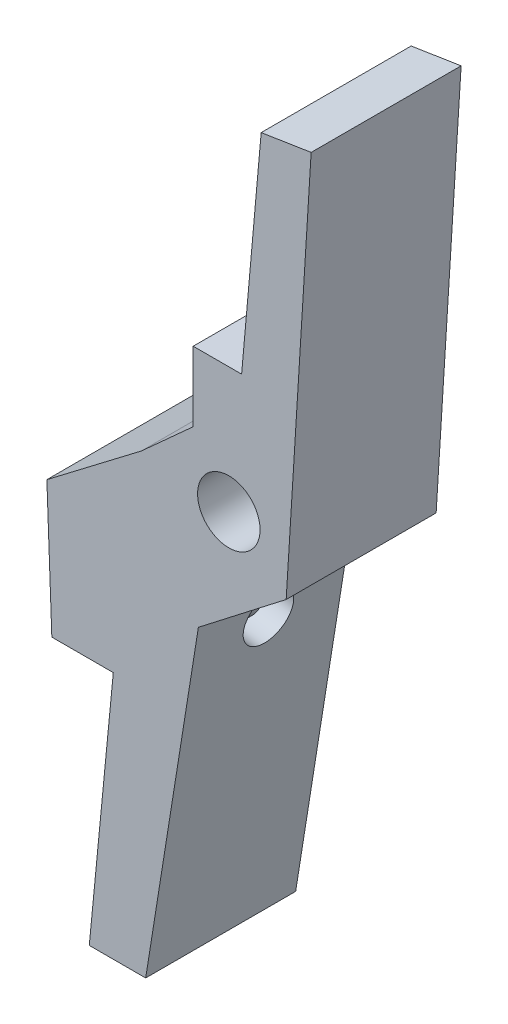
ISO-10303-21;
HEADER;
FILE_DESCRIPTION(('STEP AP214'),'2;1');
FILE_NAME('part.step','',(''),(''),'','','');
FILE_SCHEMA(('AUTOMOTIVE_DESIGN { 1 0 10303 214 1 1 1 1 }'));
ENDSEC;
DATA;
#1=APPLICATION_CONTEXT('core data for automotive mechanical design processes');
#2=APPLICATION_PROTOCOL_DEFINITION('international standard','automotive_design',2000,#1);
#3=PRODUCT_CONTEXT('',#1,'mechanical');
#4=PRODUCT('Part','Part','',(#3));
#5=PRODUCT_RELATED_PRODUCT_CATEGORY('part','',(#4));
#6=PRODUCT_DEFINITION_FORMATION('','',#4);
#7=PRODUCT_DEFINITION_CONTEXT('part definition',#1,'design');
#8=PRODUCT_DEFINITION('design','',#6,#7);
#9=PRODUCT_DEFINITION_SHAPE('','',#8);
#10=(LENGTH_UNIT() NAMED_UNIT(*) SI_UNIT(.MILLI.,.METRE.));
#11=(NAMED_UNIT(*) PLANE_ANGLE_UNIT() SI_UNIT($,.RADIAN.));
#12=(NAMED_UNIT(*) SI_UNIT($,.STERADIAN.) SOLID_ANGLE_UNIT());
#13=UNCERTAINTY_MEASURE_WITH_UNIT(LENGTH_MEASURE(1.E-05),#10,'distance_accuracy_value','');
#14=(GEOMETRIC_REPRESENTATION_CONTEXT(3) GLOBAL_UNCERTAINTY_ASSIGNED_CONTEXT((#13)) GLOBAL_UNIT_ASSIGNED_CONTEXT((#10,
#11,#12)) REPRESENTATION_CONTEXT('',''));
#15=CARTESIAN_POINT('',(0.,0.,0.));
#16=DIRECTION('',(0.,0.,1.));
#17=DIRECTION('',(1.,0.,0.));
#18=AXIS2_PLACEMENT_3D('',#15,#16,#17);
#19=CARTESIAN_POINT('',(0.,0.,12.));
#20=DIRECTION('',(0.,0.,1.));
#21=DIRECTION('',(1.,0.,0.));
#22=AXIS2_PLACEMENT_3D('',#19,#20,#21);
#23=PLANE('',#22);
#24=DIRECTION('',(-1.,0.,0.));
#25=VECTOR('',#24,1.);
#26=CARTESIAN_POINT('',(-2.84953772658631,10.0472916760826,12.));
#27=LINE('',#26,#25);
#28=CARTESIAN_POINT('',(1.02476848603479,10.0472916760826,12.));
#29=VERTEX_POINT('',#28);
#30=CARTESIAN_POINT('',(-2.84953772658631,10.0472916760826,12.));
#31=VERTEX_POINT('',#30);
#32=EDGE_CURVE('E186',#29,#31,#27,.T.);
#33=ORIENTED_EDGE('',*,*,#32,.T.);
#34=DIRECTION('',(0.,-1.,0.));
#35=VECTOR('',#34,1.);
#36=CARTESIAN_POINT('',(-2.84953772658631,4.46912261998814,12.));
#37=LINE('',#36,#35);
#38=CARTESIAN_POINT('',(-2.84953772658631,4.46912261998814,12.));
#39=VERTEX_POINT('',#38);
#40=EDGE_CURVE('E109',#31,#39,#37,.T.);
#41=ORIENTED_EDGE('',*,*,#40,.T.);
#42=DIRECTION('',(-0.741262028825612,-0.671215766070298,0.));
#43=VECTOR('',#42,1.);
#44=CARTESIAN_POINT('',(-2.84953772658631,4.46912261998814,12.));
#45=LINE('',#44,#43);
#46=CARTESIAN_POINT('',(-7.,0.710862239635323,12.));
#47=VERTEX_POINT('',#46);
#48=EDGE_CURVE('E236',#39,#47,#45,.T.);
#49=ORIENTED_EDGE('',*,*,#48,.T.);
#50=DIRECTION('',(-0.795166547645736,-0.606391096162502,0.));
#51=VECTOR('',#50,1.);
#52=CARTESIAN_POINT('',(-14.5585198268527,-5.05323728988011,12.));
#53=LINE('',#52,#51);
#54=CARTESIAN_POINT('',(-14.5585198268527,-5.05323728988011,12.));
#55=VERTEX_POINT('',#54);
#56=EDGE_CURVE('E233',#47,#55,#53,.T.);
#57=ORIENTED_EDGE('',*,*,#56,.T.);
#58=DIRECTION('',(0.0370592773706425,-0.999313069043313,0.));
#59=VECTOR('',#58,1.);
#60=CARTESIAN_POINT('',(-14.161167405107,-15.7679488611603,12.));
#61=LINE('',#60,#59);
#62=CARTESIAN_POINT('',(-14.161167405107,-15.7679488611603,12.));
#63=VERTEX_POINT('',#62);
#64=EDGE_CURVE('E235',#55,#63,#61,.T.);
#65=ORIENTED_EDGE('',*,*,#64,.T.);
#66=DIRECTION('',(1.,0.,0.));
#67=VECTOR('',#66,1.);
#68=CARTESIAN_POINT('',(-14.161167405107,-15.7679488611603,12.));
#69=LINE('',#68,#67);
#70=CARTESIAN_POINT('',(-9.24288968650914,-15.7679488611603,12.));
#71=VERTEX_POINT('',#70);
#72=EDGE_CURVE('E238',#63,#71,#69,.T.);
#73=ORIENTED_EDGE('',*,*,#72,.T.);
#74=DIRECTION('',(-0.0962982664613053,-0.995352522414319,0.));
#75=VECTOR('',#74,1.);
#76=CARTESIAN_POINT('',(-9.24288968650914,-15.7679488611603,12.));
#77=LINE('',#76,#75);
#78=CARTESIAN_POINT('',(-11.1649154997917,-35.6342799146375,12.));
#79=VERTEX_POINT('',#78);
#80=EDGE_CURVE('E244',#71,#79,#77,.T.);
#81=ORIENTED_EDGE('',*,*,#80,.T.);
#82=DIRECTION('',(1.,0.,0.));
#83=VECTOR('',#82,1.);
#84=CARTESIAN_POINT('',(-11.1649154997917,-35.6342799146375,12.));
#85=LINE('',#84,#83);
#86=CARTESIAN_POINT('',(-6.65174609692045,-35.6342799146375,12.));
#87=VERTEX_POINT('',#86);
#88=EDGE_CURVE('E246',#79,#87,#85,.T.);
#89=ORIENTED_EDGE('',*,*,#88,.T.);
#90=DIRECTION('',(0.157668148571442,0.987492154361772,0.));
#91=VECTOR('',#90,1.);
#92=CARTESIAN_POINT('',(-6.65174609692045,-35.6342799146375,12.));
#93=LINE('',#92,#91);
#94=CARTESIAN_POINT('',(-2.43508475753211,-9.22488760570282,12.));
#95=VERTEX_POINT('',#94);
#96=EDGE_CURVE('E248',#87,#95,#93,.T.);
#97=ORIENTED_EDGE('',*,*,#96,.T.);
#98=DIRECTION('',(0.790730316399644,0.61216465654799,0.));
#99=VECTOR('',#98,1.);
#100=CARTESIAN_POINT('',(4.58883890770533,-3.78713249631581,12.));
#101=LINE('',#100,#99);
#102=CARTESIAN_POINT('',(4.58883890770533,-3.78713249631581,12.));
#103=VERTEX_POINT('',#102);
#104=EDGE_CURVE('E143',#95,#103,#101,.T.);
#105=ORIENTED_EDGE('',*,*,#104,.T.);
#106=DIRECTION('',(0.0624095793533407,0.998050622165499,0.));
#107=VECTOR('',#106,1.);
#108=CARTESIAN_POINT('',(6.58883890770533,28.1967594801032,12.));
#109=LINE('',#108,#107);
#110=CARTESIAN_POINT('',(6.58883890770533,28.1967594801032,12.));
#111=VERTEX_POINT('',#110);
#112=EDGE_CURVE('E137',#103,#111,#109,.T.);
#113=ORIENTED_EDGE('',*,*,#112,.T.);
#114=DIRECTION('',(-0.987909560187012,-0.155031290038831,0.));
#115=VECTOR('',#114,1.);
#116=CARTESIAN_POINT('',(6.58883890770533,28.1967594801032,12.));
#117=LINE('',#116,#115);
#118=CARTESIAN_POINT('',(2.58883890770533,27.5690449755103,12.));
#119=VERTEX_POINT('',#118);
#120=EDGE_CURVE('E141',#111,#119,#117,.T.);
#121=ORIENTED_EDGE('',*,*,#120,.T.);
#122=DIRECTION('',(-0.0889109677130818,-0.996039577436722,0.));
#123=VECTOR('',#122,1.);
#124=CARTESIAN_POINT('',(1.02476848603479,10.0472916760826,12.));
#125=LINE('',#124,#123);
#126=EDGE_CURVE('E50',#119,#29,#125,.T.);
#127=ORIENTED_EDGE('',*,*,#126,.T.);
#128=EDGE_LOOP('',(#33,#41,#49,#57,#65,#73,#81,#89,#97,#105,#113,#121,#127));
#129=FACE_BOUND('',#128,.T.);
#130=CARTESIAN_POINT('',(0.,0.,12.));
#131=DIRECTION('',(0.,0.,1.));
#132=DIRECTION('',(1.,0.,0.));
#133=AXIS2_PLACEMENT_3D('',#130,#131,#132);
#134=CIRCLE('',#133,2.5);
#135=CARTESIAN_POINT('',(2.5,0.,12.));
#136=VERTEX_POINT('',#135);
#137=EDGE_CURVE('E165',#136,#136,#134,.T.);
#138=ORIENTED_EDGE('',*,*,#137,.F.);
#139=EDGE_LOOP('',(#138));
#140=FACE_BOUND('',#139,.T.);
#141=ADVANCED_FACE('F33',(#129,#140),#23,.T.);
#142=CARTESIAN_POINT('',(0.,0.,0.));
#143=DIRECTION('',(0.,0.,1.));
#144=DIRECTION('',(1.,0.,0.));
#145=AXIS2_PLACEMENT_3D('',#142,#143,#144);
#146=PLANE('',#145);
#147=DIRECTION('',(-1.,0.,0.));
#148=VECTOR('',#147,1.);
#149=CARTESIAN_POINT('',(-2.84953772658631,10.0472916760826,0.));
#150=LINE('',#149,#148);
#151=CARTESIAN_POINT('',(1.02476848603479,10.0472916760826,0.));
#152=VERTEX_POINT('',#151);
#153=CARTESIAN_POINT('',(-2.84953772658631,10.0472916760826,0.));
#154=VERTEX_POINT('',#153);
#155=EDGE_CURVE('E161',#152,#154,#150,.T.);
#156=ORIENTED_EDGE('',*,*,#155,.F.);
#157=DIRECTION('',(-0.0889109677130818,-0.996039577436722,0.));
#158=VECTOR('',#157,1.);
#159=CARTESIAN_POINT('',(1.02476848603479,10.0472916760826,0.));
#160=LINE('',#159,#158);
#161=CARTESIAN_POINT('',(2.58883890770533,27.5690449755103,0.));
#162=VERTEX_POINT('',#161);
#163=EDGE_CURVE('E100',#162,#152,#160,.T.);
#164=ORIENTED_EDGE('',*,*,#163,.F.);
#165=DIRECTION('',(-0.987909560187012,-0.155031290038831,0.));
#166=VECTOR('',#165,1.);
#167=CARTESIAN_POINT('',(6.58883890770533,28.1967594801032,0.));
#168=LINE('',#167,#166);
#169=CARTESIAN_POINT('',(6.58883890770533,28.1967594801032,0.));
#170=VERTEX_POINT('',#169);
#171=EDGE_CURVE('E94',#170,#162,#168,.T.);
#172=ORIENTED_EDGE('',*,*,#171,.F.);
#173=DIRECTION('',(0.0624095793533407,0.998050622165499,0.));
#174=VECTOR('',#173,1.);
#175=CARTESIAN_POINT('',(6.58883890770533,28.1967594801032,0.));
#176=LINE('',#175,#174);
#177=CARTESIAN_POINT('',(4.58883890770533,-3.78713249631581,0.));
#178=VERTEX_POINT('',#177);
#179=EDGE_CURVE('E151',#178,#170,#176,.T.);
#180=ORIENTED_EDGE('',*,*,#179,.F.);
#181=DIRECTION('',(0.790730316399644,0.61216465654799,0.));
#182=VECTOR('',#181,1.);
#183=CARTESIAN_POINT('',(4.58883890770533,-3.78713249631581,0.));
#184=LINE('',#183,#182);
#185=CARTESIAN_POINT('',(-2.43508475753211,-9.22488760570282,0.));
#186=VERTEX_POINT('',#185);
#187=EDGE_CURVE('E181',#186,#178,#184,.T.);
#188=ORIENTED_EDGE('',*,*,#187,.F.);
#189=DIRECTION('',(0.157668148571442,0.987492154361772,0.));
#190=VECTOR('',#189,1.);
#191=CARTESIAN_POINT('',(-6.65174609692045,-35.6342799146375,0.));
#192=LINE('',#191,#190);
#193=CARTESIAN_POINT('',(-6.65174609692045,-35.6342799146375,0.));
#194=VERTEX_POINT('',#193);
#195=EDGE_CURVE('E179',#194,#186,#192,.T.);
#196=ORIENTED_EDGE('',*,*,#195,.F.);
#197=DIRECTION('',(1.,0.,0.));
#198=VECTOR('',#197,1.);
#199=CARTESIAN_POINT('',(-11.1649154997917,-35.6342799146375,0.));
#200=LINE('',#199,#198);
#201=CARTESIAN_POINT('',(-11.1649154997917,-35.6342799146375,0.));
#202=VERTEX_POINT('',#201);
#203=EDGE_CURVE('E177',#202,#194,#200,.T.);
#204=ORIENTED_EDGE('',*,*,#203,.F.);
#205=DIRECTION('',(-0.0962982664613053,-0.995352522414319,0.));
#206=VECTOR('',#205,1.);
#207=CARTESIAN_POINT('',(-9.24288968650914,-15.7679488611603,0.));
#208=LINE('',#207,#206);
#209=CARTESIAN_POINT('',(-9.24288968650914,-15.7679488611603,0.));
#210=VERTEX_POINT('',#209);
#211=EDGE_CURVE('E175',#210,#202,#208,.T.);
#212=ORIENTED_EDGE('',*,*,#211,.F.);
#213=DIRECTION('',(1.,0.,0.));
#214=VECTOR('',#213,1.);
#215=CARTESIAN_POINT('',(-14.161167405107,-15.7679488611603,0.));
#216=LINE('',#215,#214);
#217=CARTESIAN_POINT('',(-14.161167405107,-15.7679488611603,0.));
#218=VERTEX_POINT('',#217);
#219=EDGE_CURVE('E173',#218,#210,#216,.T.);
#220=ORIENTED_EDGE('',*,*,#219,.F.);
#221=DIRECTION('',(0.0370592773706425,-0.999313069043313,0.));
#222=VECTOR('',#221,1.);
#223=CARTESIAN_POINT('',(-14.161167405107,-15.7679488611603,0.));
#224=LINE('',#223,#222);
#225=CARTESIAN_POINT('',(-14.5585198268527,-5.05323728988011,0.));
#226=VERTEX_POINT('',#225);
#227=EDGE_CURVE('E171',#226,#218,#224,.T.);
#228=ORIENTED_EDGE('',*,*,#227,.F.);
#229=DIRECTION('',(-0.795166547645736,-0.606391096162502,0.));
#230=VECTOR('',#229,1.);
#231=CARTESIAN_POINT('',(-14.5585198268527,-5.05323728988011,0.));
#232=LINE('',#231,#230);
#233=CARTESIAN_POINT('',(-7.,0.710862239635323,0.));
#234=VERTEX_POINT('',#233);
#235=EDGE_CURVE('E169',#234,#226,#232,.T.);
#236=ORIENTED_EDGE('',*,*,#235,.F.);
#237=DIRECTION('',(-0.741262028825612,-0.671215766070298,0.));
#238=VECTOR('',#237,1.);
#239=CARTESIAN_POINT('',(-2.84953772658631,4.46912261998814,0.));
#240=LINE('',#239,#238);
#241=CARTESIAN_POINT('',(-2.84953772658631,4.46912261998814,0.));
#242=VERTEX_POINT('',#241);
#243=EDGE_CURVE('E167',#242,#234,#240,.T.);
#244=ORIENTED_EDGE('',*,*,#243,.F.);
#245=DIRECTION('',(0.,-1.,0.));
#246=VECTOR('',#245,1.);
#247=CARTESIAN_POINT('',(-2.84953772658631,4.46912261998814,0.));
#248=LINE('',#247,#246);
#249=EDGE_CURVE('E164',#154,#242,#248,.T.);
#250=ORIENTED_EDGE('',*,*,#249,.F.);
#251=EDGE_LOOP('',(#156,#164,#172,#180,#188,#196,#204,#212,#220,#228,#236,#244,#250));
#252=FACE_BOUND('',#251,.T.);
#253=CARTESIAN_POINT('',(0.,0.,0.));
#254=DIRECTION('',(0.,0.,1.));
#255=DIRECTION('',(1.,0.,0.));
#256=AXIS2_PLACEMENT_3D('',#253,#254,#255);
#257=CIRCLE('',#256,2.5);
#258=CARTESIAN_POINT('',(2.5,0.,0.));
#259=VERTEX_POINT('',#258);
#260=EDGE_CURVE('E393',#259,#259,#257,.T.);
#261=ORIENTED_EDGE('',*,*,#260,.T.);
#262=EDGE_LOOP('',(#261));
#263=FACE_BOUND('',#262,.T.);
#264=ADVANCED_FACE('F220',(#252,#263),#146,.F.);
#265=CARTESIAN_POINT('',(-2.84953772658631,10.0472916760826,12.));
#266=DIRECTION('',(0.,-1.,0.));
#267=DIRECTION('',(0.,0.,-1.));
#268=AXIS2_PLACEMENT_3D('',#265,#266,#267);
#269=PLANE('',#268);
#270=ORIENTED_EDGE('',*,*,#155,.T.);
#271=DIRECTION('',(0.,0.,-1.));
#272=VECTOR('',#271,1.);
#273=CARTESIAN_POINT('',(-2.84953772658631,10.0472916760826,12.));
#274=LINE('',#273,#272);
#275=EDGE_CURVE('E42',#31,#154,#274,.T.);
#276=ORIENTED_EDGE('',*,*,#275,.F.);
#277=ORIENTED_EDGE('',*,*,#32,.F.);
#278=DIRECTION('',(0.,0.,-1.));
#279=VECTOR('',#278,1.);
#280=CARTESIAN_POINT('',(1.02476848603479,10.0472916760826,12.));
#281=LINE('',#280,#279);
#282=EDGE_CURVE('E157',#29,#152,#281,.T.);
#283=ORIENTED_EDGE('',*,*,#282,.T.);
#284=EDGE_LOOP('',(#270,#276,#277,#283));
#285=FACE_BOUND('',#284,.T.);
#286=ADVANCED_FACE('F218',(#285),#269,.F.);
#287=CARTESIAN_POINT('',(-2.84953772658631,4.46912261998814,12.));
#288=DIRECTION('',(1.,0.,0.));
#289=DIRECTION('',(0.,0.,-1.));
#290=AXIS2_PLACEMENT_3D('',#287,#288,#289);
#291=PLANE('',#290);
#292=ORIENTED_EDGE('',*,*,#249,.T.);
#293=DIRECTION('',(0.,0.,-1.));
#294=VECTOR('',#293,1.);
#295=CARTESIAN_POINT('',(-2.84953772658631,4.46912261998814,12.));
#296=LINE('',#295,#294);
#297=EDGE_CURVE('E211',#39,#242,#296,.T.);
#298=ORIENTED_EDGE('',*,*,#297,.F.);
#299=ORIENTED_EDGE('',*,*,#40,.F.);
#300=ORIENTED_EDGE('',*,*,#275,.T.);
#301=EDGE_LOOP('',(#292,#298,#299,#300));
#302=FACE_BOUND('',#301,.T.);
#303=ADVANCED_FACE('F214',(#302),#291,.F.);
#304=CARTESIAN_POINT('',(-2.84953772658631,4.46912261998814,12.));
#305=DIRECTION('',(0.671215766070298,-0.741262028825612,0.));
#306=DIRECTION('',(0.741262028825612,0.671215766070298,0.));
#307=AXIS2_PLACEMENT_3D('',#304,#305,#306);
#308=PLANE('',#307);
#309=ORIENTED_EDGE('',*,*,#243,.T.);
#310=DIRECTION('',(0.,0.,-1.));
#311=VECTOR('',#310,1.);
#312=CARTESIAN_POINT('',(-7.,0.710862239635323,12.));
#313=LINE('',#312,#311);
#314=EDGE_CURVE('E208',#47,#234,#313,.T.);
#315=ORIENTED_EDGE('',*,*,#314,.F.);
#316=ORIENTED_EDGE('',*,*,#48,.F.);
#317=ORIENTED_EDGE('',*,*,#297,.T.);
#318=EDGE_LOOP('',(#309,#315,#316,#317));
#319=FACE_BOUND('',#318,.T.);
#320=ADVANCED_FACE('F227',(#319),#308,.F.);
#321=CARTESIAN_POINT('',(-14.5585198268527,-5.05323728988011,12.));
#322=DIRECTION('',(0.606391096162502,-0.795166547645736,0.));
#323=DIRECTION('',(0.795166547645736,0.606391096162503,0.));
#324=AXIS2_PLACEMENT_3D('',#321,#322,#323);
#325=PLANE('',#324);
#326=ORIENTED_EDGE('',*,*,#235,.T.);
#327=DIRECTION('',(0.,0.,-1.));
#328=VECTOR('',#327,1.);
#329=CARTESIAN_POINT('',(-14.5585198268527,-5.05323728988011,12.));
#330=LINE('',#329,#328);
#331=EDGE_CURVE('E205',#55,#226,#330,.T.);
#332=ORIENTED_EDGE('',*,*,#331,.F.);
#333=ORIENTED_EDGE('',*,*,#56,.F.);
#334=ORIENTED_EDGE('',*,*,#314,.T.);
#335=EDGE_LOOP('',(#326,#332,#333,#334));
#336=FACE_BOUND('',#335,.T.);
#337=ADVANCED_FACE('F231',(#336),#325,.F.);
#338=CARTESIAN_POINT('',(-14.161167405107,-15.7679488611603,12.));
#339=DIRECTION('',(0.999313069043313,0.0370592773706425,0.));
#340=DIRECTION('',(-0.0370592773706425,0.999313069043313,0.));
#341=AXIS2_PLACEMENT_3D('',#338,#339,#340);
#342=PLANE('',#341);
#343=ORIENTED_EDGE('',*,*,#227,.T.);
#344=DIRECTION('',(0.,0.,-1.));
#345=VECTOR('',#344,1.);
#346=CARTESIAN_POINT('',(-14.161167405107,-15.7679488611603,12.));
#347=LINE('',#346,#345);
#348=EDGE_CURVE('E202',#63,#218,#347,.T.);
#349=ORIENTED_EDGE('',*,*,#348,.F.);
#350=ORIENTED_EDGE('',*,*,#64,.F.);
#351=ORIENTED_EDGE('',*,*,#331,.T.);
#352=EDGE_LOOP('',(#343,#349,#350,#351));
#353=FACE_BOUND('',#352,.T.);
#354=ADVANCED_FACE('F274',(#353),#342,.F.);
#355=CARTESIAN_POINT('',(-14.161167405107,-15.7679488611603,12.));
#356=DIRECTION('',(0.,1.,0.));
#357=DIRECTION('',(-1.,0.,0.));
#358=AXIS2_PLACEMENT_3D('',#355,#356,#357);
#359=PLANE('',#358);
#360=ORIENTED_EDGE('',*,*,#219,.T.);
#361=DIRECTION('',(0.,0.,-1.));
#362=VECTOR('',#361,1.);
#363=CARTESIAN_POINT('',(-9.24288968650914,-15.7679488611603,12.));
#364=LINE('',#363,#362);
#365=EDGE_CURVE('E199',#71,#210,#364,.T.);
#366=ORIENTED_EDGE('',*,*,#365,.F.);
#367=ORIENTED_EDGE('',*,*,#72,.F.);
#368=ORIENTED_EDGE('',*,*,#348,.T.);
#369=EDGE_LOOP('',(#360,#366,#367,#368));
#370=FACE_BOUND('',#369,.T.);
#371=ADVANCED_FACE('F271',(#370),#359,.F.);
#372=CARTESIAN_POINT('',(-9.24288968650914,-15.7679488611603,12.));
#373=DIRECTION('',(0.995352522414319,-0.0962982664613053,0.));
#374=DIRECTION('',(0.0962982664613053,0.995352522414319,0.));
#375=AXIS2_PLACEMENT_3D('',#372,#373,#374);
#376=PLANE('',#375);
#377=ORIENTED_EDGE('',*,*,#211,.T.);
#378=DIRECTION('',(0.,0.,-1.));
#379=VECTOR('',#378,1.);
#380=CARTESIAN_POINT('',(-11.1649154997917,-35.6342799146375,12.));
#381=LINE('',#380,#379);
#382=EDGE_CURVE('E196',#79,#202,#381,.T.);
#383=ORIENTED_EDGE('',*,*,#382,.F.);
#384=ORIENTED_EDGE('',*,*,#80,.F.);
#385=ORIENTED_EDGE('',*,*,#365,.T.);
#386=EDGE_LOOP('',(#377,#383,#384,#385));
#387=FACE_BOUND('',#386,.T.);
#388=ADVANCED_FACE('F267',(#387),#376,.F.);
#389=CARTESIAN_POINT('',(-11.1649154997917,-35.6342799146375,12.));
#390=DIRECTION('',(0.,1.,0.));
#391=DIRECTION('',(-1.,0.,0.));
#392=AXIS2_PLACEMENT_3D('',#389,#390,#391);
#393=PLANE('',#392);
#394=ORIENTED_EDGE('',*,*,#203,.T.);
#395=DIRECTION('',(0.,0.,-1.));
#396=VECTOR('',#395,1.);
#397=CARTESIAN_POINT('',(-6.65174609692045,-35.6342799146375,12.));
#398=LINE('',#397,#396);
#399=EDGE_CURVE('E193',#87,#194,#398,.T.);
#400=ORIENTED_EDGE('',*,*,#399,.F.);
#401=ORIENTED_EDGE('',*,*,#88,.F.);
#402=ORIENTED_EDGE('',*,*,#382,.T.);
#403=EDGE_LOOP('',(#394,#400,#401,#402));
#404=FACE_BOUND('',#403,.T.);
#405=ADVANCED_FACE('F263',(#404),#393,.F.);
#406=CARTESIAN_POINT('',(-6.65174609692045,-35.6342799146375,12.));
#407=DIRECTION('',(-0.987492154361772,0.157668148571442,0.));
#408=DIRECTION('',(-0.157668148571442,-0.987492154361772,0.));
#409=AXIS2_PLACEMENT_3D('',#406,#407,#408);
#410=PLANE('',#409);
#411=CARTESIAN_POINT('',(-2.82925512896071,-11.6936179916073,6.));
#412=DIRECTION('',(0.987492154361772,-0.157668148571442,0.));
#413=DIRECTION('',(0.157668148571442,0.987492154361772,0.));
#414=AXIS2_PLACEMENT_3D('',#411,#412,#413);
#415=CIRCLE('',#414,2.);
#416=CARTESIAN_POINT('',(-2.51391883181783,-9.71863368288371,6.));
#417=VERTEX_POINT('',#416);
#418=EDGE_CURVE('E386',#417,#417,#415,.T.);
#419=ORIENTED_EDGE('',*,*,#418,.F.);
#420=EDGE_LOOP('',(#419));
#421=FACE_BOUND('',#420,.T.);
#422=ORIENTED_EDGE('',*,*,#195,.T.);
#423=DIRECTION('',(0.,0.,-1.));
#424=VECTOR('',#423,1.);
#425=CARTESIAN_POINT('',(-2.43508475753211,-9.22488760570282,12.));
#426=LINE('',#425,#424);
#427=EDGE_CURVE('E190',#95,#186,#426,.T.);
#428=ORIENTED_EDGE('',*,*,#427,.F.);
#429=ORIENTED_EDGE('',*,*,#96,.F.);
#430=ORIENTED_EDGE('',*,*,#399,.T.);
#431=EDGE_LOOP('',(#422,#428,#429,#430));
#432=FACE_BOUND('',#431,.T.);
#433=ADVANCED_FACE('F254',(#421,#432),#410,.F.);
#434=CARTESIAN_POINT('',(4.58883890770533,-3.78713249631581,12.));
#435=DIRECTION('',(-0.61216465654799,0.790730316399644,0.));
#436=DIRECTION('',(-0.790730316399644,-0.61216465654799,0.));
#437=AXIS2_PLACEMENT_3D('',#434,#435,#436);
#438=PLANE('',#437);
#439=ORIENTED_EDGE('',*,*,#187,.T.);
#440=DIRECTION('',(0.,0.,-1.));
#441=VECTOR('',#440,1.);
#442=CARTESIAN_POINT('',(4.58883890770533,-3.78713249631581,12.));
#443=LINE('',#442,#441);
#444=EDGE_CURVE('E152',#103,#178,#443,.T.);
#445=ORIENTED_EDGE('',*,*,#444,.F.);
#446=ORIENTED_EDGE('',*,*,#104,.F.);
#447=ORIENTED_EDGE('',*,*,#427,.T.);
#448=EDGE_LOOP('',(#439,#445,#446,#447));
#449=FACE_BOUND('',#448,.T.);
#450=ADVANCED_FACE('F258',(#449),#438,.F.);
#451=CARTESIAN_POINT('',(6.58883890770533,28.1967594801032,12.));
#452=DIRECTION('',(-0.998050622165499,0.0624095793533407,0.));
#453=DIRECTION('',(-0.0624095793533407,-0.998050622165499,0.));
#454=AXIS2_PLACEMENT_3D('',#451,#452,#453);
#455=PLANE('',#454);
#456=ORIENTED_EDGE('',*,*,#179,.T.);
#457=DIRECTION('',(0.,0.,-1.));
#458=VECTOR('',#457,1.);
#459=CARTESIAN_POINT('',(6.58883890770533,28.1967594801032,12.));
#460=LINE('',#459,#458);
#461=EDGE_CURVE('E148',#111,#170,#460,.T.);
#462=ORIENTED_EDGE('',*,*,#461,.F.);
#463=ORIENTED_EDGE('',*,*,#112,.F.);
#464=ORIENTED_EDGE('',*,*,#444,.T.);
#465=EDGE_LOOP('',(#456,#462,#463,#464));
#466=FACE_BOUND('',#465,.T.);
#467=ADVANCED_FACE('F149',(#466),#455,.F.);
#468=CARTESIAN_POINT('',(6.58883890770533,28.1967594801032,12.));
#469=DIRECTION('',(0.155031290038831,-0.987909560187012,0.));
#470=DIRECTION('',(0.987909560187012,0.155031290038831,0.));
#471=AXIS2_PLACEMENT_3D('',#468,#469,#470);
#472=PLANE('',#471);
#473=ORIENTED_EDGE('',*,*,#171,.T.);
#474=DIRECTION('',(0.,0.,-1.));
#475=VECTOR('',#474,1.);
#476=CARTESIAN_POINT('',(2.58883890770533,27.5690449755103,12.));
#477=LINE('',#476,#475);
#478=EDGE_CURVE('E153',#119,#162,#477,.T.);
#479=ORIENTED_EDGE('',*,*,#478,.F.);
#480=ORIENTED_EDGE('',*,*,#120,.F.);
#481=ORIENTED_EDGE('',*,*,#461,.T.);
#482=EDGE_LOOP('',(#473,#479,#480,#481));
#483=FACE_BOUND('',#482,.T.);
#484=ADVANCED_FACE('F155',(#483),#472,.F.);
#485=CARTESIAN_POINT('',(1.02476848603479,10.0472916760826,12.));
#486=DIRECTION('',(0.996039577436722,-0.0889109677130818,0.));
#487=DIRECTION('',(0.0889109677130818,0.996039577436722,0.));
#488=AXIS2_PLACEMENT_3D('',#485,#486,#487);
#489=PLANE('',#488);
#490=ORIENTED_EDGE('',*,*,#163,.T.);
#491=ORIENTED_EDGE('',*,*,#282,.F.);
#492=ORIENTED_EDGE('',*,*,#126,.F.);
#493=ORIENTED_EDGE('',*,*,#478,.T.);
#494=EDGE_LOOP('',(#490,#491,#492,#493));
#495=FACE_BOUND('',#494,.T.);
#496=ADVANCED_FACE('F293',(#495),#489,.F.);
#497=CARTESIAN_POINT('',(0.,0.,12.));
#498=DIRECTION('',(0.,0.,-1.));
#499=DIRECTION('',(-1.,0.,0.));
#500=AXIS2_PLACEMENT_3D('',#497,#498,#499);
#501=CYLINDRICAL_SURFACE('',#500,2.5);
#502=ORIENTED_EDGE('',*,*,#137,.T.);
#503=EDGE_LOOP('',(#502));
#504=FACE_BOUND('',#503,.T.);
#505=ORIENTED_EDGE('',*,*,#260,.F.);
#506=EDGE_LOOP('',(#505));
#507=FACE_BOUND('',#506,.T.);
#508=ADVANCED_FACE('F290',(#504,#507),#501,.F.);
#509=CARTESIAN_POINT('',(-7.76671590076957,-10.90527724875,6.));
#510=DIRECTION('',(0.987492154361772,-0.157668148571442,0.));
#511=DIRECTION('',(0.157668148571442,0.987492154361772,0.));
#512=AXIS2_PLACEMENT_3D('',#509,#510,#511);
#513=CYLINDRICAL_SURFACE('',#512,2.);
#514=CARTESIAN_POINT('',(-7.76671590076957,-10.90527724875,6.));
#515=DIRECTION('',(0.987492154361772,-0.157668148571442,0.));
#516=DIRECTION('',(0.157668148571442,0.987492154361772,0.));
#517=AXIS2_PLACEMENT_3D('',#514,#515,#516);
#518=CIRCLE('',#517,2.);
#519=CARTESIAN_POINT('',(-7.45137960362669,-8.9302929400265,6.));
#520=VERTEX_POINT('',#519);
#521=EDGE_CURVE('E389',#520,#520,#518,.T.);
#522=ORIENTED_EDGE('',*,*,#521,.F.);
#523=EDGE_LOOP('',(#522));
#524=FACE_BOUND('',#523,.T.);
#525=ORIENTED_EDGE('',*,*,#418,.T.);
#526=EDGE_LOOP('',(#525));
#527=FACE_BOUND('',#526,.T.);
#528=ADVANCED_FACE('F345',(#524,#527),#513,.F.);
#529=CARTESIAN_POINT('',(-7.76671590076957,-10.90527724875,6.));
#530=DIRECTION('',(0.987492154361772,-0.157668148571442,0.));
#531=DIRECTION('',(0.157668148571442,0.987492154361772,0.));
#532=AXIS2_PLACEMENT_3D('',#529,#530,#531);
#533=PLANE('',#532);
#534=CARTESIAN_POINT('',(-7.76671590076957,-10.90527724875,6.));
#535=DIRECTION('',(0.987492154361772,-0.157668148571442,0.));
#536=DIRECTION('',(0.157668148571442,0.987492154361772,0.));
#537=AXIS2_PLACEMENT_3D('',#534,#535,#536);
#538=CIRCLE('',#537,1.5);
#539=CARTESIAN_POINT('',(-7.53021367791241,-9.42403901720739,6.));
#540=VERTEX_POINT('',#539);
#541=EDGE_CURVE('E385',#540,#540,#538,.T.);
#542=ORIENTED_EDGE('',*,*,#541,.F.);
#543=EDGE_LOOP('',(#542));
#544=FACE_BOUND('',#543,.T.);
#545=ORIENTED_EDGE('',*,*,#521,.T.);
#546=EDGE_LOOP('',(#545));
#547=FACE_BOUND('',#546,.T.);
#548=ADVANCED_FACE('F351',(#544,#547),#533,.T.);
#549=CARTESIAN_POINT('',(-3.81674728332248,-11.5359498430358,6.));
#550=DIRECTION('',(-0.987492154361772,0.157668148571442,0.));
#551=DIRECTION('',(-0.157668148571442,-0.987492154361772,0.));
#552=AXIS2_PLACEMENT_3D('',#549,#550,#551);
#553=CYLINDRICAL_SURFACE('',#552,1.5);
#554=CARTESIAN_POINT('',(-5.29798551486514,-11.2994476201786,6.));
#555=DIRECTION('',(-0.987492154361772,0.157668148571442,0.));
#556=DIRECTION('',(-0.157668148571442,-0.987492154361772,0.));
#557=AXIS2_PLACEMENT_3D('',#554,#555,#556);
#558=CIRCLE('',#557,1.5);
#559=CARTESIAN_POINT('',(-5.5344877377223,-12.7806858517213,6.));
#560=VERTEX_POINT('',#559);
#561=EDGE_CURVE('E11',#560,#560,#558,.T.);
#562=ORIENTED_EDGE('',*,*,#561,.T.);
#563=EDGE_LOOP('',(#562));
#564=FACE_BOUND('',#563,.T.);
#565=ORIENTED_EDGE('',*,*,#541,.T.);
#566=EDGE_LOOP('',(#565));
#567=FACE_BOUND('',#566,.T.);
#568=ADVANCED_FACE('F359',(#564,#567),#553,.T.);
#569=CARTESIAN_POINT('',(-5.29798551486514,-11.2994476201786,6.));
#570=DIRECTION('',(0.987492154361772,-0.157668148571442,0.));
#571=DIRECTION('',(0.157668148571442,0.987492154361772,0.));
#572=AXIS2_PLACEMENT_3D('',#569,#570,#571);
#573=SPHERICAL_SURFACE('',#572,1.5);
#574=ORIENTED_EDGE('',*,*,#561,.F.);
#575=EDGE_LOOP('',(#574));
#576=FACE_BOUND('',#575,.T.);
#577=ADVANCED_FACE('F35',(#576),#573,.T.);
#578=CLOSED_SHELL('',(#141,#264,#286,#303,#320,#337,#354,#371,#388,#405,#433,#450,#467,#484,
#496,#508,#528,#548,#568,#577));
#579=MANIFOLD_SOLID_BREP('B2',#578);
#580=ADVANCED_BREP_SHAPE_REPRESENTATION('',(#18,#579),#14);
#581=SHAPE_DEFINITION_REPRESENTATION(#9,#580);
ENDSEC;
END-ISO-10303-21;
